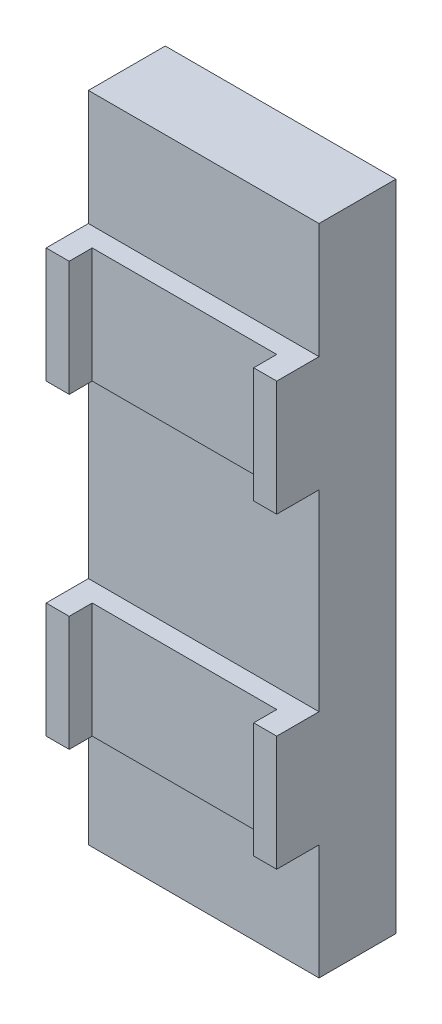
ISO-10303-21;
HEADER;
FILE_DESCRIPTION(('STEP AP214'),'2;1');
FILE_NAME('part.step','',(''),(''),'','','');
FILE_SCHEMA(('AUTOMOTIVE_DESIGN { 1 0 10303 214 1 1 1 1 }'));
ENDSEC;
DATA;
#1=APPLICATION_CONTEXT('core data for automotive mechanical design processes');
#2=APPLICATION_PROTOCOL_DEFINITION('international standard','automotive_design',2000,#1);
#3=PRODUCT_CONTEXT('',#1,'mechanical');
#4=PRODUCT('Part','Part','',(#3));
#5=PRODUCT_RELATED_PRODUCT_CATEGORY('part','',(#4));
#6=PRODUCT_DEFINITION_FORMATION('','',#4);
#7=PRODUCT_DEFINITION_CONTEXT('part definition',#1,'design');
#8=PRODUCT_DEFINITION('design','',#6,#7);
#9=PRODUCT_DEFINITION_SHAPE('','',#8);
#10=(LENGTH_UNIT() NAMED_UNIT(*) SI_UNIT(.MILLI.,.METRE.));
#11=(NAMED_UNIT(*) PLANE_ANGLE_UNIT() SI_UNIT($,.RADIAN.));
#12=(NAMED_UNIT(*) SI_UNIT($,.STERADIAN.) SOLID_ANGLE_UNIT());
#13=UNCERTAINTY_MEASURE_WITH_UNIT(LENGTH_MEASURE(1.E-05),#10,'distance_accuracy_value','');
#14=(GEOMETRIC_REPRESENTATION_CONTEXT(3) GLOBAL_UNCERTAINTY_ASSIGNED_CONTEXT((#13)) GLOBAL_UNIT_ASSIGNED_CONTEXT((#10,
#11,#12)) REPRESENTATION_CONTEXT('',''));
#15=CARTESIAN_POINT('',(0.,0.,0.));
#16=DIRECTION('',(0.,0.,1.));
#17=DIRECTION('',(1.,0.,0.));
#18=AXIS2_PLACEMENT_3D('',#15,#16,#17);
#19=CARTESIAN_POINT('',(0.,0.,12.5));
#20=DIRECTION('',(0.,0.,1.));
#21=DIRECTION('',(1.,0.,0.));
#22=AXIS2_PLACEMENT_3D('',#19,#20,#21);
#23=PLANE('',#22);
#24=DIRECTION('',(-1.,0.,0.));
#25=VECTOR('',#24,1.);
#26=CARTESIAN_POINT('',(0.,70.,12.5));
#27=LINE('',#26,#25);
#28=CARTESIAN_POINT('',(27.,70.,12.5));
#29=VERTEX_POINT('',#28);
#30=CARTESIAN_POINT('',(3.00000000000001,70.,12.5));
#31=VERTEX_POINT('',#30);
#32=EDGE_CURVE('E55',#29,#31,#27,.T.);
#33=ORIENTED_EDGE('',*,*,#32,.T.);
#34=DIRECTION('',(0.,1.,0.));
#35=VECTOR('',#34,1.);
#36=CARTESIAN_POINT('',(3.00000000000001,70.,12.5));
#37=LINE('',#36,#35);
#38=CARTESIAN_POINT('',(3.00000000000001,55.,12.5));
#39=VERTEX_POINT('',#38);
#40=EDGE_CURVE('E50',#39,#31,#37,.T.);
#41=ORIENTED_EDGE('',*,*,#40,.F.);
#42=DIRECTION('',(1.,0.,0.));
#43=VECTOR('',#42,1.);
#44=CARTESIAN_POINT('',(0.,55.,12.5));
#45=LINE('',#44,#43);
#46=CARTESIAN_POINT('',(27.,55.,12.5));
#47=VERTEX_POINT('',#46);
#48=EDGE_CURVE('E287',#39,#47,#45,.T.);
#49=ORIENTED_EDGE('',*,*,#48,.T.);
#50=DIRECTION('',(0.,-1.,0.));
#51=VECTOR('',#50,1.);
#52=CARTESIAN_POINT('',(27.,70.,12.5));
#53=LINE('',#52,#51);
#54=EDGE_CURVE('E245',#29,#47,#53,.T.);
#55=ORIENTED_EDGE('',*,*,#54,.F.);
#56=EDGE_LOOP('',(#33,#41,#49,#55));
#57=FACE_BOUND('',#56,.T.);
#58=ADVANCED_FACE('F35',(#57),#23,.T.);
#59=CARTESIAN_POINT('',(0.,0.,12.5));
#60=DIRECTION('',(0.,0.,1.));
#61=DIRECTION('',(1.,0.,0.));
#62=AXIS2_PLACEMENT_3D('',#59,#60,#61);
#63=PLANE('',#62);
#64=DIRECTION('',(-1.,0.,0.));
#65=VECTOR('',#64,1.);
#66=CARTESIAN_POINT('',(0.,30.,12.5));
#67=LINE('',#66,#65);
#68=CARTESIAN_POINT('',(27.,30.,12.5));
#69=VERTEX_POINT('',#68);
#70=CARTESIAN_POINT('',(2.99999999999999,30.,12.5));
#71=VERTEX_POINT('',#70);
#72=EDGE_CURVE('E267',#69,#71,#67,.T.);
#73=ORIENTED_EDGE('',*,*,#72,.T.);
#74=DIRECTION('',(0.,1.,0.));
#75=VECTOR('',#74,1.);
#76=CARTESIAN_POINT('',(3.,30.,12.5));
#77=LINE('',#76,#75);
#78=CARTESIAN_POINT('',(2.99999999999999,15.,12.5));
#79=VERTEX_POINT('',#78);
#80=EDGE_CURVE('E207',#79,#71,#77,.T.);
#81=ORIENTED_EDGE('',*,*,#80,.F.);
#82=DIRECTION('',(1.,0.,0.));
#83=VECTOR('',#82,1.);
#84=CARTESIAN_POINT('',(0.,15.,12.5));
#85=LINE('',#84,#83);
#86=CARTESIAN_POINT('',(27.,15.,12.5));
#87=VERTEX_POINT('',#86);
#88=EDGE_CURVE('E265',#79,#87,#85,.T.);
#89=ORIENTED_EDGE('',*,*,#88,.T.);
#90=DIRECTION('',(0.,-1.,0.));
#91=VECTOR('',#90,1.);
#92=CARTESIAN_POINT('',(27.,30.,12.5));
#93=LINE('',#92,#91);
#94=EDGE_CURVE('E226',#69,#87,#93,.T.);
#95=ORIENTED_EDGE('',*,*,#94,.F.);
#96=EDGE_LOOP('',(#73,#81,#89,#95));
#97=FACE_BOUND('',#96,.T.);
#98=ADVANCED_FACE('F374',(#97),#63,.T.);
#99=CARTESIAN_POINT('',(0.,0.,10.));
#100=DIRECTION('',(0.,0.,-1.));
#101=DIRECTION('',(-1.,0.,0.));
#102=AXIS2_PLACEMENT_3D('',#99,#100,#101);
#103=PLANE('',#102);
#104=DIRECTION('',(1.,0.,0.));
#105=VECTOR('',#104,1.);
#106=CARTESIAN_POINT('',(0.,15.,10.));
#107=LINE('',#106,#105);
#108=CARTESIAN_POINT('',(0.,15.,10.));
#109=VERTEX_POINT('',#108);
#110=CARTESIAN_POINT('',(30.,15.,10.));
#111=VERTEX_POINT('',#110);
#112=EDGE_CURVE('E264',#109,#111,#107,.T.);
#113=ORIENTED_EDGE('',*,*,#112,.F.);
#114=DIRECTION('',(0.,-1.,0.));
#115=VECTOR('',#114,1.);
#116=CARTESIAN_POINT('',(0.,0.,10.));
#117=LINE('',#116,#115);
#118=CARTESIAN_POINT('',(0.,0.,10.));
#119=VERTEX_POINT('',#118);
#120=EDGE_CURVE('E303',#109,#119,#117,.T.);
#121=ORIENTED_EDGE('',*,*,#120,.T.);
#122=DIRECTION('',(1.,0.,0.));
#123=VECTOR('',#122,1.);
#124=CARTESIAN_POINT('',(0.,0.,10.));
#125=LINE('',#124,#123);
#126=CARTESIAN_POINT('',(30.,0.,10.));
#127=VERTEX_POINT('',#126);
#128=EDGE_CURVE('E301',#119,#127,#125,.T.);
#129=ORIENTED_EDGE('',*,*,#128,.T.);
#130=DIRECTION('',(0.,1.,0.));
#131=VECTOR('',#130,1.);
#132=CARTESIAN_POINT('',(30.,0.,10.));
#133=LINE('',#132,#131);
#134=EDGE_CURVE('E306',#127,#111,#133,.T.);
#135=ORIENTED_EDGE('',*,*,#134,.T.);
#136=EDGE_LOOP('',(#113,#121,#129,#135));
#137=FACE_BOUND('',#136,.T.);
#138=ADVANCED_FACE('F380',(#137),#103,.F.);
#139=DIRECTION('',(-1.,0.,0.));
#140=VECTOR('',#139,1.);
#141=CARTESIAN_POINT('',(0.,30.,10.));
#142=LINE('',#141,#140);
#143=CARTESIAN_POINT('',(30.,30.,10.));
#144=VERTEX_POINT('',#143);
#145=CARTESIAN_POINT('',(0.,30.,10.));
#146=VERTEX_POINT('',#145);
#147=EDGE_CURVE('E268',#144,#146,#142,.T.);
#148=ORIENTED_EDGE('',*,*,#147,.F.);
#149=CARTESIAN_POINT('',(30.,55.,10.));
#150=VERTEX_POINT('',#149);
#151=EDGE_CURVE('E309',#144,#150,#133,.T.);
#152=ORIENTED_EDGE('',*,*,#151,.T.);
#153=DIRECTION('',(1.,0.,0.));
#154=VECTOR('',#153,1.);
#155=CARTESIAN_POINT('',(0.,55.,10.));
#156=LINE('',#155,#154);
#157=CARTESIAN_POINT('',(0.,55.,10.));
#158=VERTEX_POINT('',#157);
#159=EDGE_CURVE('E286',#158,#150,#156,.T.);
#160=ORIENTED_EDGE('',*,*,#159,.F.);
#161=EDGE_CURVE('E302',#158,#146,#117,.T.);
#162=ORIENTED_EDGE('',*,*,#161,.T.);
#163=EDGE_LOOP('',(#148,#152,#160,#162));
#164=FACE_BOUND('',#163,.T.);
#165=ADVANCED_FACE('F346',(#164),#103,.F.);
#166=DIRECTION('',(-1.,0.,0.));
#167=VECTOR('',#166,1.);
#168=CARTESIAN_POINT('',(0.,70.,10.));
#169=LINE('',#168,#167);
#170=CARTESIAN_POINT('',(30.,70.,10.));
#171=VERTEX_POINT('',#170);
#172=CARTESIAN_POINT('',(0.,70.,10.));
#173=VERTEX_POINT('',#172);
#174=EDGE_CURVE('E178',#171,#173,#169,.T.);
#175=ORIENTED_EDGE('',*,*,#174,.F.);
#176=CARTESIAN_POINT('',(30.,85.,10.));
#177=VERTEX_POINT('',#176);
#178=EDGE_CURVE('E305',#171,#177,#133,.T.);
#179=ORIENTED_EDGE('',*,*,#178,.T.);
#180=DIRECTION('',(-1.,0.,0.));
#181=VECTOR('',#180,1.);
#182=CARTESIAN_POINT('',(0.,85.,10.));
#183=LINE('',#182,#181);
#184=CARTESIAN_POINT('',(0.,85.,10.));
#185=VERTEX_POINT('',#184);
#186=EDGE_CURVE('E308',#177,#185,#183,.T.);
#187=ORIENTED_EDGE('',*,*,#186,.T.);
#188=EDGE_CURVE('E299',#185,#173,#117,.T.);
#189=ORIENTED_EDGE('',*,*,#188,.T.);
#190=EDGE_LOOP('',(#175,#179,#187,#189));
#191=FACE_BOUND('',#190,.T.);
#192=ADVANCED_FACE('F342',(#191),#103,.F.);
#193=CARTESIAN_POINT('',(0.,0.,10.));
#194=DIRECTION('',(1.,0.,0.));
#195=DIRECTION('',(0.,0.,-1.));
#196=AXIS2_PLACEMENT_3D('',#193,#194,#195);
#197=PLANE('',#196);
#198=DIRECTION('',(0.,-1.,0.));
#199=VECTOR('',#198,1.);
#200=CARTESIAN_POINT('',(0.,0.,0.));
#201=LINE('',#200,#199);
#202=CARTESIAN_POINT('',(0.,85.,0.));
#203=VERTEX_POINT('',#202);
#204=CARTESIAN_POINT('',(0.,0.,0.));
#205=VERTEX_POINT('',#204);
#206=EDGE_CURVE('E298',#203,#205,#201,.T.);
#207=ORIENTED_EDGE('',*,*,#206,.T.);
#208=DIRECTION('',(0.,0.,-1.));
#209=VECTOR('',#208,1.);
#210=CARTESIAN_POINT('',(0.,0.,10.));
#211=LINE('',#210,#209);
#212=EDGE_CURVE('E11',#119,#205,#211,.T.);
#213=ORIENTED_EDGE('',*,*,#212,.F.);
#214=ORIENTED_EDGE('',*,*,#120,.F.);
#215=DIRECTION('',(0.,0.,-1.));
#216=VECTOR('',#215,1.);
#217=CARTESIAN_POINT('',(0.,15.,12.5));
#218=LINE('',#217,#216);
#219=CARTESIAN_POINT('',(0.,15.,15.5));
#220=VERTEX_POINT('',#219);
#221=EDGE_CURVE('E270',#220,#109,#218,.T.);
#222=ORIENTED_EDGE('',*,*,#221,.F.);
#223=DIRECTION('',(0.,-1.,0.));
#224=VECTOR('',#223,1.);
#225=CARTESIAN_POINT('',(0.,30.,15.5));
#226=LINE('',#225,#224);
#227=CARTESIAN_POINT('',(0.,30.,15.5));
#228=VERTEX_POINT('',#227);
#229=EDGE_CURVE('E211',#228,#220,#226,.T.);
#230=ORIENTED_EDGE('',*,*,#229,.F.);
#231=DIRECTION('',(0.,0.,-1.));
#232=VECTOR('',#231,1.);
#233=CARTESIAN_POINT('',(0.,30.,12.5));
#234=LINE('',#233,#232);
#235=EDGE_CURVE('E277',#228,#146,#234,.T.);
#236=ORIENTED_EDGE('',*,*,#235,.T.);
#237=ORIENTED_EDGE('',*,*,#161,.F.);
#238=DIRECTION('',(0.,0.,-1.));
#239=VECTOR('',#238,1.);
#240=CARTESIAN_POINT('',(0.,55.,12.5));
#241=LINE('',#240,#239);
#242=CARTESIAN_POINT('',(0.,55.,15.5));
#243=VERTEX_POINT('',#242);
#244=EDGE_CURVE('E188',#243,#158,#241,.T.);
#245=ORIENTED_EDGE('',*,*,#244,.F.);
#246=DIRECTION('',(0.,-1.,0.));
#247=VECTOR('',#246,1.);
#248=CARTESIAN_POINT('',(0.,70.,15.5));
#249=LINE('',#248,#247);
#250=CARTESIAN_POINT('',(0.,70.,15.5));
#251=VERTEX_POINT('',#250);
#252=EDGE_CURVE('E184',#251,#243,#249,.T.);
#253=ORIENTED_EDGE('',*,*,#252,.F.);
#254=DIRECTION('',(0.,0.,-1.));
#255=VECTOR('',#254,1.);
#256=CARTESIAN_POINT('',(0.,70.,12.5));
#257=LINE('',#256,#255);
#258=EDGE_CURVE('E171',#251,#173,#257,.T.);
#259=ORIENTED_EDGE('',*,*,#258,.T.);
#260=ORIENTED_EDGE('',*,*,#188,.F.);
#261=DIRECTION('',(0.,0.,-1.));
#262=VECTOR('',#261,1.);
#263=CARTESIAN_POINT('',(0.,85.,10.));
#264=LINE('',#263,#262);
#265=EDGE_CURVE('E311',#185,#203,#264,.T.);
#266=ORIENTED_EDGE('',*,*,#265,.T.);
#267=EDGE_LOOP('',(#207,#213,#214,#222,#230,#236,#237,#245,#253,#259,#260,#266));
#268=FACE_BOUND('',#267,.T.);
#269=ADVANCED_FACE('F37',(#268),#197,.F.);
#270=CARTESIAN_POINT('',(0.,0.,10.));
#271=DIRECTION('',(0.,1.,0.));
#272=DIRECTION('',(0.,0.,1.));
#273=AXIS2_PLACEMENT_3D('',#270,#271,#272);
#274=PLANE('',#273);
#275=DIRECTION('',(1.,0.,0.));
#276=VECTOR('',#275,1.);
#277=CARTESIAN_POINT('',(0.,0.,0.));
#278=LINE('',#277,#276);
#279=CARTESIAN_POINT('',(30.,0.,0.));
#280=VERTEX_POINT('',#279);
#281=EDGE_CURVE('E313',#205,#280,#278,.T.);
#282=ORIENTED_EDGE('',*,*,#281,.T.);
#283=DIRECTION('',(0.,0.,-1.));
#284=VECTOR('',#283,1.);
#285=CARTESIAN_POINT('',(30.,0.,10.));
#286=LINE('',#285,#284);
#287=EDGE_CURVE('E43',#127,#280,#286,.T.);
#288=ORIENTED_EDGE('',*,*,#287,.F.);
#289=ORIENTED_EDGE('',*,*,#128,.F.);
#290=ORIENTED_EDGE('',*,*,#212,.T.);
#291=EDGE_LOOP('',(#282,#288,#289,#290));
#292=FACE_BOUND('',#291,.T.);
#293=ADVANCED_FACE('F398',(#292),#274,.F.);
#294=CARTESIAN_POINT('',(30.,0.,10.));
#295=DIRECTION('',(-1.,0.,0.));
#296=DIRECTION('',(0.,0.,1.));
#297=AXIS2_PLACEMENT_3D('',#294,#295,#296);
#298=PLANE('',#297);
#299=DIRECTION('',(0.,1.,0.));
#300=VECTOR('',#299,1.);
#301=CARTESIAN_POINT('',(30.,0.,0.));
#302=LINE('',#301,#300);
#303=CARTESIAN_POINT('',(30.,85.,0.));
#304=VERTEX_POINT('',#303);
#305=EDGE_CURVE('E315',#280,#304,#302,.T.);
#306=ORIENTED_EDGE('',*,*,#305,.T.);
#307=DIRECTION('',(0.,0.,-1.));
#308=VECTOR('',#307,1.);
#309=CARTESIAN_POINT('',(30.,85.,10.));
#310=LINE('',#309,#308);
#311=EDGE_CURVE('E321',#177,#304,#310,.T.);
#312=ORIENTED_EDGE('',*,*,#311,.F.);
#313=ORIENTED_EDGE('',*,*,#178,.F.);
#314=DIRECTION('',(0.,0.,-1.));
#315=VECTOR('',#314,1.);
#316=CARTESIAN_POINT('',(30.,70.,12.5));
#317=LINE('',#316,#315);
#318=CARTESIAN_POINT('',(30.,70.,15.5));
#319=VERTEX_POINT('',#318);
#320=EDGE_CURVE('E181',#319,#171,#317,.T.);
#321=ORIENTED_EDGE('',*,*,#320,.F.);
#322=DIRECTION('',(0.,1.,0.));
#323=VECTOR('',#322,1.);
#324=CARTESIAN_POINT('',(30.,70.,15.5));
#325=LINE('',#324,#323);
#326=CARTESIAN_POINT('',(30.,55.,15.5));
#327=VERTEX_POINT('',#326);
#328=EDGE_CURVE('E246',#327,#319,#325,.T.);
#329=ORIENTED_EDGE('',*,*,#328,.F.);
#330=DIRECTION('',(0.,0.,-1.));
#331=VECTOR('',#330,1.);
#332=CARTESIAN_POINT('',(30.,55.,12.5));
#333=LINE('',#332,#331);
#334=EDGE_CURVE('E294',#327,#150,#333,.T.);
#335=ORIENTED_EDGE('',*,*,#334,.T.);
#336=ORIENTED_EDGE('',*,*,#151,.F.);
#337=DIRECTION('',(0.,0.,-1.));
#338=VECTOR('',#337,1.);
#339=CARTESIAN_POINT('',(30.,30.,12.5));
#340=LINE('',#339,#338);
#341=CARTESIAN_POINT('',(30.,30.,15.5));
#342=VERTEX_POINT('',#341);
#343=EDGE_CURVE('E280',#342,#144,#340,.T.);
#344=ORIENTED_EDGE('',*,*,#343,.F.);
#345=DIRECTION('',(0.,1.,0.));
#346=VECTOR('',#345,1.);
#347=CARTESIAN_POINT('',(30.,30.,15.5));
#348=LINE('',#347,#346);
#349=CARTESIAN_POINT('',(30.,15.,15.5));
#350=VERTEX_POINT('',#349);
#351=EDGE_CURVE('E227',#350,#342,#348,.T.);
#352=ORIENTED_EDGE('',*,*,#351,.F.);
#353=DIRECTION('',(0.,0.,-1.));
#354=VECTOR('',#353,1.);
#355=CARTESIAN_POINT('',(30.,15.,12.5));
#356=LINE('',#355,#354);
#357=EDGE_CURVE('E283',#350,#111,#356,.T.);
#358=ORIENTED_EDGE('',*,*,#357,.T.);
#359=ORIENTED_EDGE('',*,*,#134,.F.);
#360=ORIENTED_EDGE('',*,*,#287,.T.);
#361=EDGE_LOOP('',(#306,#312,#313,#321,#329,#335,#336,#344,#352,#358,#359,#360));
#362=FACE_BOUND('',#361,.T.);
#363=ADVANCED_FACE('F328',(#362),#298,.F.);
#364=CARTESIAN_POINT('',(0.,85.,10.));
#365=DIRECTION('',(0.,-1.,0.));
#366=DIRECTION('',(0.,0.,-1.));
#367=AXIS2_PLACEMENT_3D('',#364,#365,#366);
#368=PLANE('',#367);
#369=DIRECTION('',(-1.,0.,0.));
#370=VECTOR('',#369,1.);
#371=CARTESIAN_POINT('',(0.,85.,0.));
#372=LINE('',#371,#370);
#373=EDGE_CURVE('E317',#304,#203,#372,.T.);
#374=ORIENTED_EDGE('',*,*,#373,.T.);
#375=ORIENTED_EDGE('',*,*,#265,.F.);
#376=ORIENTED_EDGE('',*,*,#186,.F.);
#377=ORIENTED_EDGE('',*,*,#311,.T.);
#378=EDGE_LOOP('',(#374,#375,#376,#377));
#379=FACE_BOUND('',#378,.T.);
#380=ADVANCED_FACE('F338',(#379),#368,.F.);
#381=CARTESIAN_POINT('',(0.,0.,0.));
#382=DIRECTION('',(0.,0.,-1.));
#383=DIRECTION('',(-1.,0.,0.));
#384=AXIS2_PLACEMENT_3D('',#381,#382,#383);
#385=PLANE('',#384);
#386=ORIENTED_EDGE('',*,*,#206,.F.);
#387=ORIENTED_EDGE('',*,*,#373,.F.);
#388=ORIENTED_EDGE('',*,*,#305,.F.);
#389=ORIENTED_EDGE('',*,*,#281,.F.);
#390=EDGE_LOOP('',(#386,#387,#388,#389));
#391=FACE_BOUND('',#390,.T.);
#392=ADVANCED_FACE('F335',(#391),#385,.T.);
#393=CARTESIAN_POINT('',(0.,55.,12.5));
#394=DIRECTION('',(0.,1.,0.));
#395=DIRECTION('',(0.,0.,1.));
#396=AXIS2_PLACEMENT_3D('',#393,#394,#395);
#397=PLANE('',#396);
#398=ORIENTED_EDGE('',*,*,#159,.T.);
#399=ORIENTED_EDGE('',*,*,#334,.F.);
#400=DIRECTION('',(1.,0.,0.));
#401=VECTOR('',#400,1.);
#402=CARTESIAN_POINT('',(30.,55.,15.5));
#403=LINE('',#402,#401);
#404=CARTESIAN_POINT('',(27.,55.,15.5));
#405=VERTEX_POINT('',#404);
#406=EDGE_CURVE('E253',#405,#327,#403,.T.);
#407=ORIENTED_EDGE('',*,*,#406,.F.);
#408=DIRECTION('',(0.,0.,-1.));
#409=VECTOR('',#408,1.);
#410=CARTESIAN_POINT('',(27.,55.,15.5));
#411=LINE('',#410,#409);
#412=EDGE_CURVE('E256',#405,#47,#411,.T.);
#413=ORIENTED_EDGE('',*,*,#412,.T.);
#414=ORIENTED_EDGE('',*,*,#48,.F.);
#415=DIRECTION('',(0.,0.,-1.));
#416=VECTOR('',#415,1.);
#417=CARTESIAN_POINT('',(3.,55.,15.5));
#418=LINE('',#417,#416);
#419=CARTESIAN_POINT('',(3.,55.,15.5));
#420=VERTEX_POINT('',#419);
#421=EDGE_CURVE('E204',#420,#39,#418,.T.);
#422=ORIENTED_EDGE('',*,*,#421,.F.);
#423=DIRECTION('',(1.,0.,0.));
#424=VECTOR('',#423,1.);
#425=CARTESIAN_POINT('',(0.,55.,15.5));
#426=LINE('',#425,#424);
#427=EDGE_CURVE('E191',#243,#420,#426,.T.);
#428=ORIENTED_EDGE('',*,*,#427,.F.);
#429=ORIENTED_EDGE('',*,*,#244,.T.);
#430=EDGE_LOOP('',(#398,#399,#407,#413,#414,#422,#428,#429));
#431=FACE_BOUND('',#430,.T.);
#432=ADVANCED_FACE('F348',(#431),#397,.F.);
#433=CARTESIAN_POINT('',(0.,70.,12.5));
#434=DIRECTION('',(0.,-1.,0.));
#435=DIRECTION('',(0.,0.,-1.));
#436=AXIS2_PLACEMENT_3D('',#433,#434,#435);
#437=PLANE('',#436);
#438=ORIENTED_EDGE('',*,*,#174,.T.);
#439=ORIENTED_EDGE('',*,*,#258,.F.);
#440=DIRECTION('',(-1.,0.,0.));
#441=VECTOR('',#440,1.);
#442=CARTESIAN_POINT('',(0.,70.,15.5));
#443=LINE('',#442,#441);
#444=CARTESIAN_POINT('',(3.00000000000001,70.,15.5));
#445=VERTEX_POINT('',#444);
#446=EDGE_CURVE('E176',#445,#251,#443,.T.);
#447=ORIENTED_EDGE('',*,*,#446,.F.);
#448=DIRECTION('',(0.,0.,-1.));
#449=VECTOR('',#448,1.);
#450=CARTESIAN_POINT('',(3.00000000000001,70.,15.5));
#451=LINE('',#450,#449);
#452=EDGE_CURVE('E201',#445,#31,#451,.T.);
#453=ORIENTED_EDGE('',*,*,#452,.T.);
#454=ORIENTED_EDGE('',*,*,#32,.F.);
#455=DIRECTION('',(0.,0.,-1.));
#456=VECTOR('',#455,1.);
#457=CARTESIAN_POINT('',(27.,70.,15.5));
#458=LINE('',#457,#456);
#459=CARTESIAN_POINT('',(27.,70.,15.5));
#460=VERTEX_POINT('',#459);
#461=EDGE_CURVE('E261',#460,#29,#458,.T.);
#462=ORIENTED_EDGE('',*,*,#461,.F.);
#463=DIRECTION('',(-1.,0.,0.));
#464=VECTOR('',#463,1.);
#465=CARTESIAN_POINT('',(30.,70.,15.5));
#466=LINE('',#465,#464);
#467=EDGE_CURVE('E249',#319,#460,#466,.T.);
#468=ORIENTED_EDGE('',*,*,#467,.F.);
#469=ORIENTED_EDGE('',*,*,#320,.T.);
#470=EDGE_LOOP('',(#438,#439,#447,#453,#454,#462,#468,#469));
#471=FACE_BOUND('',#470,.T.);
#472=ADVANCED_FACE('F173',(#471),#437,.F.);
#473=CARTESIAN_POINT('',(0.,15.,12.5));
#474=DIRECTION('',(0.,1.,0.));
#475=DIRECTION('',(0.,0.,1.));
#476=AXIS2_PLACEMENT_3D('',#473,#474,#475);
#477=PLANE('',#476);
#478=ORIENTED_EDGE('',*,*,#112,.T.);
#479=ORIENTED_EDGE('',*,*,#357,.F.);
#480=DIRECTION('',(1.,0.,0.));
#481=VECTOR('',#480,1.);
#482=CARTESIAN_POINT('',(30.,15.,15.5));
#483=LINE('',#482,#481);
#484=CARTESIAN_POINT('',(27.,15.,15.5));
#485=VERTEX_POINT('',#484);
#486=EDGE_CURVE('E234',#485,#350,#483,.T.);
#487=ORIENTED_EDGE('',*,*,#486,.F.);
#488=DIRECTION('',(0.,0.,-1.));
#489=VECTOR('',#488,1.);
#490=CARTESIAN_POINT('',(27.,15.,15.5));
#491=LINE('',#490,#489);
#492=EDGE_CURVE('E237',#485,#87,#491,.T.);
#493=ORIENTED_EDGE('',*,*,#492,.T.);
#494=ORIENTED_EDGE('',*,*,#88,.F.);
#495=DIRECTION('',(0.,0.,-1.));
#496=VECTOR('',#495,1.);
#497=CARTESIAN_POINT('',(2.99999999999999,15.,15.5));
#498=LINE('',#497,#496);
#499=CARTESIAN_POINT('',(2.99999999999999,15.,15.5));
#500=VERTEX_POINT('',#499);
#501=EDGE_CURVE('E223',#500,#79,#498,.T.);
#502=ORIENTED_EDGE('',*,*,#501,.F.);
#503=DIRECTION('',(1.,0.,0.));
#504=VECTOR('',#503,1.);
#505=CARTESIAN_POINT('',(0.,15.,15.5));
#506=LINE('',#505,#504);
#507=EDGE_CURVE('E214',#220,#500,#506,.T.);
#508=ORIENTED_EDGE('',*,*,#507,.F.);
#509=ORIENTED_EDGE('',*,*,#221,.T.);
#510=EDGE_LOOP('',(#478,#479,#487,#493,#494,#502,#508,#509));
#511=FACE_BOUND('',#510,.T.);
#512=ADVANCED_FACE('F385',(#511),#477,.F.);
#513=CARTESIAN_POINT('',(0.,30.,12.5));
#514=DIRECTION('',(0.,-1.,0.));
#515=DIRECTION('',(0.,0.,-1.));
#516=AXIS2_PLACEMENT_3D('',#513,#514,#515);
#517=PLANE('',#516);
#518=ORIENTED_EDGE('',*,*,#147,.T.);
#519=ORIENTED_EDGE('',*,*,#235,.F.);
#520=DIRECTION('',(-1.,0.,0.));
#521=VECTOR('',#520,1.);
#522=CARTESIAN_POINT('',(0.,30.,15.5));
#523=LINE('',#522,#521);
#524=CARTESIAN_POINT('',(3.,30.,15.5));
#525=VERTEX_POINT('',#524);
#526=EDGE_CURVE('E208',#525,#228,#523,.T.);
#527=ORIENTED_EDGE('',*,*,#526,.F.);
#528=DIRECTION('',(0.,0.,-1.));
#529=VECTOR('',#528,1.);
#530=CARTESIAN_POINT('',(3.,30.,15.5));
#531=LINE('',#530,#529);
#532=EDGE_CURVE('E218',#525,#71,#531,.T.);
#533=ORIENTED_EDGE('',*,*,#532,.T.);
#534=ORIENTED_EDGE('',*,*,#72,.F.);
#535=DIRECTION('',(0.,0.,-1.));
#536=VECTOR('',#535,1.);
#537=CARTESIAN_POINT('',(27.,30.,15.5));
#538=LINE('',#537,#536);
#539=CARTESIAN_POINT('',(27.,30.,15.5));
#540=VERTEX_POINT('',#539);
#541=EDGE_CURVE('E242',#540,#69,#538,.T.);
#542=ORIENTED_EDGE('',*,*,#541,.F.);
#543=DIRECTION('',(-1.,0.,0.));
#544=VECTOR('',#543,1.);
#545=CARTESIAN_POINT('',(30.,30.,15.5));
#546=LINE('',#545,#544);
#547=EDGE_CURVE('E230',#342,#540,#546,.T.);
#548=ORIENTED_EDGE('',*,*,#547,.F.);
#549=ORIENTED_EDGE('',*,*,#343,.T.);
#550=EDGE_LOOP('',(#518,#519,#527,#533,#534,#542,#548,#549));
#551=FACE_BOUND('',#550,.T.);
#552=ADVANCED_FACE('F414',(#551),#517,.F.);
#553=CARTESIAN_POINT('',(27.,70.,15.5));
#554=DIRECTION('',(1.,0.,0.));
#555=DIRECTION('',(0.,1.,0.));
#556=AXIS2_PLACEMENT_3D('',#553,#554,#555);
#557=PLANE('',#556);
#558=ORIENTED_EDGE('',*,*,#54,.T.);
#559=ORIENTED_EDGE('',*,*,#412,.F.);
#560=DIRECTION('',(0.,-1.,0.));
#561=VECTOR('',#560,1.);
#562=CARTESIAN_POINT('',(27.,70.,15.5));
#563=LINE('',#562,#561);
#564=EDGE_CURVE('E251',#460,#405,#563,.T.);
#565=ORIENTED_EDGE('',*,*,#564,.F.);
#566=ORIENTED_EDGE('',*,*,#461,.T.);
#567=EDGE_LOOP('',(#558,#559,#565,#566));
#568=FACE_BOUND('',#567,.T.);
#569=ADVANCED_FACE('F359',(#568),#557,.F.);
#570=CARTESIAN_POINT('',(0.,0.,15.5));
#571=DIRECTION('',(0.,0.,-1.));
#572=DIRECTION('',(-1.,0.,0.));
#573=AXIS2_PLACEMENT_3D('',#570,#571,#572);
#574=PLANE('',#573);
#575=ORIENTED_EDGE('',*,*,#328,.T.);
#576=ORIENTED_EDGE('',*,*,#467,.T.);
#577=ORIENTED_EDGE('',*,*,#564,.T.);
#578=ORIENTED_EDGE('',*,*,#406,.T.);
#579=EDGE_LOOP('',(#575,#576,#577,#578));
#580=FACE_BOUND('',#579,.T.);
#581=ADVANCED_FACE('F353',(#580),#574,.F.);
#582=CARTESIAN_POINT('',(27.,30.,15.5));
#583=DIRECTION('',(1.,0.,0.));
#584=DIRECTION('',(0.,1.,0.));
#585=AXIS2_PLACEMENT_3D('',#582,#583,#584);
#586=PLANE('',#585);
#587=ORIENTED_EDGE('',*,*,#94,.T.);
#588=ORIENTED_EDGE('',*,*,#492,.F.);
#589=DIRECTION('',(0.,-1.,0.));
#590=VECTOR('',#589,1.);
#591=CARTESIAN_POINT('',(27.,30.,15.5));
#592=LINE('',#591,#590);
#593=EDGE_CURVE('E232',#540,#485,#592,.T.);
#594=ORIENTED_EDGE('',*,*,#593,.F.);
#595=ORIENTED_EDGE('',*,*,#541,.T.);
#596=EDGE_LOOP('',(#587,#588,#594,#595));
#597=FACE_BOUND('',#596,.T.);
#598=ADVANCED_FACE('F424',(#597),#586,.F.);
#599=CARTESIAN_POINT('',(0.,0.,15.5));
#600=DIRECTION('',(0.,0.,-1.));
#601=DIRECTION('',(-1.,0.,0.));
#602=AXIS2_PLACEMENT_3D('',#599,#600,#601);
#603=PLANE('',#602);
#604=ORIENTED_EDGE('',*,*,#351,.T.);
#605=ORIENTED_EDGE('',*,*,#547,.T.);
#606=ORIENTED_EDGE('',*,*,#593,.T.);
#607=ORIENTED_EDGE('',*,*,#486,.T.);
#608=EDGE_LOOP('',(#604,#605,#606,#607));
#609=FACE_BOUND('',#608,.T.);
#610=ADVANCED_FACE('F419',(#609),#603,.F.);
#611=CARTESIAN_POINT('',(3.,30.,15.5));
#612=DIRECTION('',(-1.,0.,0.));
#613=DIRECTION('',(0.,-1.,0.));
#614=AXIS2_PLACEMENT_3D('',#611,#612,#613);
#615=PLANE('',#614);
#616=ORIENTED_EDGE('',*,*,#80,.T.);
#617=ORIENTED_EDGE('',*,*,#532,.F.);
#618=DIRECTION('',(0.,1.,0.));
#619=VECTOR('',#618,1.);
#620=CARTESIAN_POINT('',(3.,30.,15.5));
#621=LINE('',#620,#619);
#622=EDGE_CURVE('E216',#500,#525,#621,.T.);
#623=ORIENTED_EDGE('',*,*,#622,.F.);
#624=ORIENTED_EDGE('',*,*,#501,.T.);
#625=EDGE_LOOP('',(#616,#617,#623,#624));
#626=FACE_BOUND('',#625,.T.);
#627=ADVANCED_FACE('F370',(#626),#615,.F.);
#628=CARTESIAN_POINT('',(0.,0.,15.5));
#629=DIRECTION('',(0.,0.,-1.));
#630=DIRECTION('',(-1.,0.,0.));
#631=AXIS2_PLACEMENT_3D('',#628,#629,#630);
#632=PLANE('',#631);
#633=ORIENTED_EDGE('',*,*,#526,.T.);
#634=ORIENTED_EDGE('',*,*,#229,.T.);
#635=ORIENTED_EDGE('',*,*,#507,.T.);
#636=ORIENTED_EDGE('',*,*,#622,.T.);
#637=EDGE_LOOP('',(#633,#634,#635,#636));
#638=FACE_BOUND('',#637,.T.);
#639=ADVANCED_FACE('F363',(#638),#632,.F.);
#640=CARTESIAN_POINT('',(3.00000000000001,70.,15.5));
#641=DIRECTION('',(-1.,0.,0.));
#642=DIRECTION('',(0.,-1.,0.));
#643=AXIS2_PLACEMENT_3D('',#640,#641,#642);
#644=PLANE('',#643);
#645=ORIENTED_EDGE('',*,*,#40,.T.);
#646=ORIENTED_EDGE('',*,*,#452,.F.);
#647=DIRECTION('',(0.,1.,0.));
#648=VECTOR('',#647,1.);
#649=CARTESIAN_POINT('',(3.00000000000001,70.,15.5));
#650=LINE('',#649,#648);
#651=EDGE_CURVE('E195',#420,#445,#650,.T.);
#652=ORIENTED_EDGE('',*,*,#651,.F.);
#653=ORIENTED_EDGE('',*,*,#421,.T.);
#654=EDGE_LOOP('',(#645,#646,#652,#653));
#655=FACE_BOUND('',#654,.T.);
#656=ADVANCED_FACE('F361',(#655),#644,.F.);
#657=CARTESIAN_POINT('',(0.,0.,15.5));
#658=DIRECTION('',(0.,0.,-1.));
#659=DIRECTION('',(-1.,0.,0.));
#660=AXIS2_PLACEMENT_3D('',#657,#658,#659);
#661=PLANE('',#660);
#662=ORIENTED_EDGE('',*,*,#446,.T.);
#663=ORIENTED_EDGE('',*,*,#252,.T.);
#664=ORIENTED_EDGE('',*,*,#427,.T.);
#665=ORIENTED_EDGE('',*,*,#651,.T.);
#666=EDGE_LOOP('',(#662,#663,#664,#665));
#667=FACE_BOUND('',#666,.T.);
#668=ADVANCED_FACE('F193',(#667),#661,.F.);
#669=CLOSED_SHELL('',(#58,#98,#138,#165,#192,#269,#293,#363,#380,#392,#432,#472,#512,#552,#569,
#581,#598,#610,#627,#639,#656,#668));
#670=MANIFOLD_SOLID_BREP('B2',#669);
#671=ADVANCED_BREP_SHAPE_REPRESENTATION('',(#18,#670),#14);
#672=SHAPE_DEFINITION_REPRESENTATION(#9,#671);
ENDSEC;
END-ISO-10303-21;
